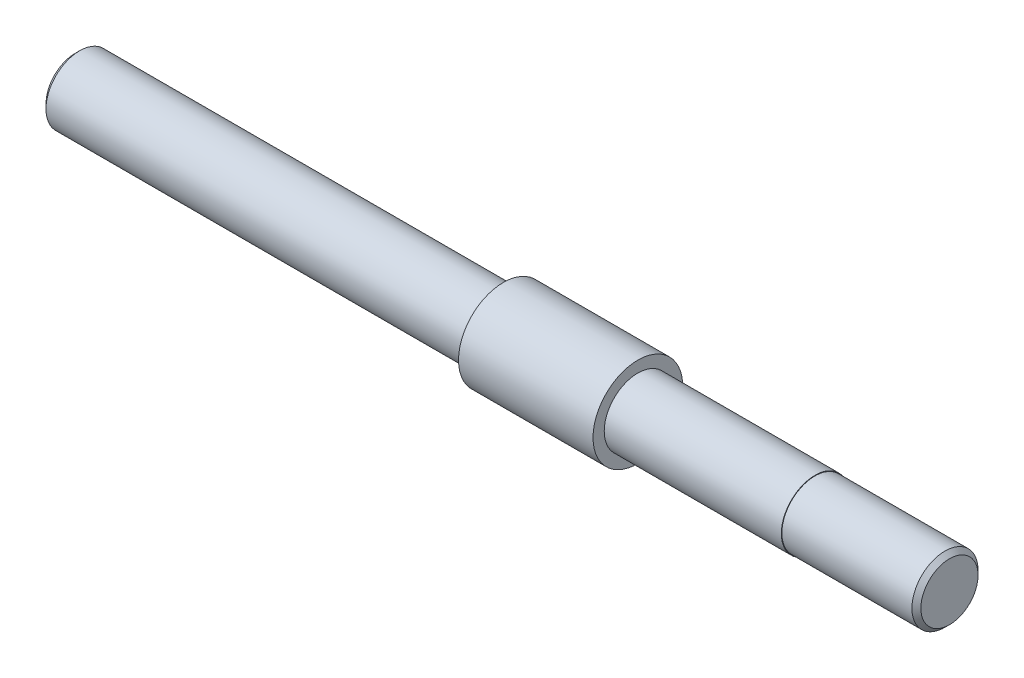
ISO-10303-21;
HEADER;
FILE_DESCRIPTION(('STEP AP214'),'2;1');
FILE_NAME('part.step','',(''),(''),'','','');
FILE_SCHEMA(('AUTOMOTIVE_DESIGN { 1 0 10303 214 1 1 1 1 }'));
ENDSEC;
DATA;
#1=APPLICATION_CONTEXT('core data for automotive mechanical design processes');
#2=APPLICATION_PROTOCOL_DEFINITION('international standard','automotive_design',2000,#1);
#3=PRODUCT_CONTEXT('',#1,'mechanical');
#4=PRODUCT('Part','Part','',(#3));
#5=PRODUCT_RELATED_PRODUCT_CATEGORY('part','',(#4));
#6=PRODUCT_DEFINITION_FORMATION('','',#4);
#7=PRODUCT_DEFINITION_CONTEXT('part definition',#1,'design');
#8=PRODUCT_DEFINITION('design','',#6,#7);
#9=PRODUCT_DEFINITION_SHAPE('','',#8);
#10=(LENGTH_UNIT() NAMED_UNIT(*) SI_UNIT(.MILLI.,.METRE.));
#11=(NAMED_UNIT(*) PLANE_ANGLE_UNIT() SI_UNIT($,.RADIAN.));
#12=(NAMED_UNIT(*) SI_UNIT($,.STERADIAN.) SOLID_ANGLE_UNIT());
#13=UNCERTAINTY_MEASURE_WITH_UNIT(LENGTH_MEASURE(1.E-05),#10,'distance_accuracy_value','');
#14=(GEOMETRIC_REPRESENTATION_CONTEXT(3) GLOBAL_UNCERTAINTY_ASSIGNED_CONTEXT((#13)) GLOBAL_UNIT_ASSIGNED_CONTEXT((#10,
#11,#12)) REPRESENTATION_CONTEXT('',''));
#15=CARTESIAN_POINT('',(0.,0.,0.));
#16=DIRECTION('',(0.,0.,1.));
#17=DIRECTION('',(1.,0.,0.));
#18=AXIS2_PLACEMENT_3D('',#15,#16,#17);
#19=CARTESIAN_POINT('',(0.,0.,0.));
#20=DIRECTION('',(-1.,0.,0.));
#21=DIRECTION('',(0.,0.,1.));
#22=AXIS2_PLACEMENT_3D('',#19,#20,#21);
#23=PLANE('',#22);
#24=CARTESIAN_POINT('',(0.,0.,0.));
#25=DIRECTION('',(-1.,0.,0.));
#26=DIRECTION('',(0.,0.,1.));
#27=AXIS2_PLACEMENT_3D('',#24,#25,#26);
#28=CIRCLE('',#27,1.27499999999999);
#29=CARTESIAN_POINT('',(0.,0.,1.27499999999999));
#30=VERTEX_POINT('',#29);
#31=EDGE_CURVE('E10',#30,#30,#28,.F.);
#32=ORIENTED_EDGE('',*,*,#31,.T.);
#33=EDGE_LOOP('',(#32));
#34=FACE_BOUND('',#33,.T.);
#35=ADVANCED_FACE('F34',(#34),#23,.F.);
#36=CARTESIAN_POINT('',(-12.0887675927148,0.,0.));
#37=DIRECTION('',(-1.,0.,0.));
#38=DIRECTION('',(0.,0.,1.));
#39=AXIS2_PLACEMENT_3D('',#36,#37,#38);
#40=CYLINDRICAL_SURFACE('',#39,1.475);
#41=CARTESIAN_POINT('',(-0.200000000000006,0.,0.));
#42=DIRECTION('',(-1.,0.,0.));
#43=DIRECTION('',(0.,0.,1.));
#44=AXIS2_PLACEMENT_3D('',#41,#42,#43);
#45=CIRCLE('',#44,1.475);
#46=CARTESIAN_POINT('',(-0.200000000000006,0.,1.475));
#47=VERTEX_POINT('',#46);
#48=EDGE_CURVE('E41',#47,#47,#45,.T.);
#49=ORIENTED_EDGE('',*,*,#48,.T.);
#50=EDGE_LOOP('',(#49));
#51=FACE_BOUND('',#50,.T.);
#52=CARTESIAN_POINT('',(-6.,0.,0.));
#53=DIRECTION('',(-1.,0.,0.));
#54=DIRECTION('',(0.,0.,1.));
#55=AXIS2_PLACEMENT_3D('',#52,#53,#54);
#56=CIRCLE('',#55,1.475);
#57=CARTESIAN_POINT('',(-6.,0.,1.475));
#58=VERTEX_POINT('',#57);
#59=EDGE_CURVE('E54',#58,#58,#56,.T.);
#60=ORIENTED_EDGE('',*,*,#59,.F.);
#61=EDGE_LOOP('',(#60));
#62=FACE_BOUND('',#61,.T.);
#63=ADVANCED_FACE('F102',(#51,#62),#40,.T.);
#64=CARTESIAN_POINT('',(-6.,1.475,0.));
#65=DIRECTION('',(-1.,0.,0.));
#66=DIRECTION('',(0.,0.,1.));
#67=AXIS2_PLACEMENT_3D('',#64,#65,#66);
#68=PLANE('',#67);
#69=CARTESIAN_POINT('',(-6.,0.,0.));
#70=DIRECTION('',(-1.,0.,0.));
#71=DIRECTION('',(0.,0.,1.));
#72=AXIS2_PLACEMENT_3D('',#69,#70,#71);
#73=CIRCLE('',#72,1.5);
#74=CARTESIAN_POINT('',(-6.,0.,1.5));
#75=VERTEX_POINT('',#74);
#76=EDGE_CURVE('E57',#75,#75,#73,.T.);
#77=ORIENTED_EDGE('',*,*,#76,.F.);
#78=EDGE_LOOP('',(#77));
#79=FACE_BOUND('',#78,.T.);
#80=ORIENTED_EDGE('',*,*,#59,.T.);
#81=EDGE_LOOP('',(#80));
#82=FACE_BOUND('',#81,.T.);
#83=ADVANCED_FACE('F96',(#79,#82),#68,.F.);
#84=CARTESIAN_POINT('',(-12.0887675927148,0.,0.));
#85=DIRECTION('',(-1.,0.,0.));
#86=DIRECTION('',(0.,0.,1.));
#87=AXIS2_PLACEMENT_3D('',#84,#85,#86);
#88=CYLINDRICAL_SURFACE('',#87,1.5);
#89=CARTESIAN_POINT('',(-13.9,0.,0.));
#90=DIRECTION('',(-1.,0.,0.));
#91=DIRECTION('',(0.,0.,1.));
#92=AXIS2_PLACEMENT_3D('',#89,#90,#91);
#93=CIRCLE('',#92,1.5);
#94=CARTESIAN_POINT('',(-13.9,0.,1.5));
#95=VERTEX_POINT('',#94);
#96=EDGE_CURVE('E60',#95,#95,#93,.T.);
#97=ORIENTED_EDGE('',*,*,#96,.F.);
#98=EDGE_LOOP('',(#97));
#99=FACE_BOUND('',#98,.T.);
#100=ORIENTED_EDGE('',*,*,#76,.T.);
#101=EDGE_LOOP('',(#100));
#102=FACE_BOUND('',#101,.T.);
#103=ADVANCED_FACE('F90',(#99,#102),#88,.T.);
#104=CARTESIAN_POINT('',(-13.9,1.5,0.));
#105=DIRECTION('',(-1.,0.,0.));
#106=DIRECTION('',(0.,0.,1.));
#107=AXIS2_PLACEMENT_3D('',#104,#105,#106);
#108=PLANE('',#107);
#109=CARTESIAN_POINT('',(-13.9,0.,0.));
#110=DIRECTION('',(-1.,0.,0.));
#111=DIRECTION('',(0.,0.,1.));
#112=AXIS2_PLACEMENT_3D('',#109,#110,#111);
#113=CIRCLE('',#112,2.);
#114=CARTESIAN_POINT('',(-13.9,0.,2.));
#115=VERTEX_POINT('',#114);
#116=EDGE_CURVE('E63',#115,#115,#113,.T.);
#117=ORIENTED_EDGE('',*,*,#116,.F.);
#118=EDGE_LOOP('',(#117));
#119=FACE_BOUND('',#118,.T.);
#120=ORIENTED_EDGE('',*,*,#96,.T.);
#121=EDGE_LOOP('',(#120));
#122=FACE_BOUND('',#121,.T.);
#123=ADVANCED_FACE('F84',(#119,#122),#108,.F.);
#124=CARTESIAN_POINT('',(-12.0887675927148,0.,0.));
#125=DIRECTION('',(-1.,0.,0.));
#126=DIRECTION('',(0.,0.,1.));
#127=AXIS2_PLACEMENT_3D('',#124,#125,#126);
#128=CYLINDRICAL_SURFACE('',#127,2.);
#129=CARTESIAN_POINT('',(-19.9,0.,0.));
#130=DIRECTION('',(-1.,0.,0.));
#131=DIRECTION('',(0.,0.,1.));
#132=AXIS2_PLACEMENT_3D('',#129,#130,#131);
#133=CIRCLE('',#132,2.);
#134=CARTESIAN_POINT('',(-19.9,0.,2.));
#135=VERTEX_POINT('',#134);
#136=EDGE_CURVE('E66',#135,#135,#133,.T.);
#137=ORIENTED_EDGE('',*,*,#136,.F.);
#138=EDGE_LOOP('',(#137));
#139=FACE_BOUND('',#138,.T.);
#140=ORIENTED_EDGE('',*,*,#116,.T.);
#141=EDGE_LOOP('',(#140));
#142=FACE_BOUND('',#141,.T.);
#143=ADVANCED_FACE('F78',(#139,#142),#128,.T.);
#144=CARTESIAN_POINT('',(-19.9,2.,0.));
#145=DIRECTION('',(1.,0.,0.));
#146=DIRECTION('',(0.,0.,-1.));
#147=AXIS2_PLACEMENT_3D('',#144,#145,#146);
#148=PLANE('',#147);
#149=CARTESIAN_POINT('',(-19.9,0.,0.));
#150=DIRECTION('',(-1.,0.,0.));
#151=DIRECTION('',(0.,0.,1.));
#152=AXIS2_PLACEMENT_3D('',#149,#150,#151);
#153=CIRCLE('',#152,1.5);
#154=CARTESIAN_POINT('',(-19.9,0.,1.5));
#155=VERTEX_POINT('',#154);
#156=EDGE_CURVE('E69',#155,#155,#153,.T.);
#157=ORIENTED_EDGE('',*,*,#156,.F.);
#158=EDGE_LOOP('',(#157));
#159=FACE_BOUND('',#158,.T.);
#160=ORIENTED_EDGE('',*,*,#136,.T.);
#161=EDGE_LOOP('',(#160));
#162=FACE_BOUND('',#161,.T.);
#163=ADVANCED_FACE('F75',(#159,#162),#148,.F.);
#164=CARTESIAN_POINT('',(-12.0887675927148,0.,0.));
#165=DIRECTION('',(-1.,0.,0.));
#166=DIRECTION('',(0.,0.,1.));
#167=AXIS2_PLACEMENT_3D('',#164,#165,#166);
#168=CYLINDRICAL_SURFACE('',#167,1.5);
#169=CARTESIAN_POINT('',(-38.8,0.,0.));
#170=DIRECTION('',(1.,0.,0.));
#171=DIRECTION('',(0.,0.,-1.));
#172=AXIS2_PLACEMENT_3D('',#169,#170,#171);
#173=CIRCLE('',#172,1.5);
#174=CARTESIAN_POINT('',(-38.8,0.,-1.5));
#175=VERTEX_POINT('',#174);
#176=EDGE_CURVE('E45',#175,#175,#173,.T.);
#177=ORIENTED_EDGE('',*,*,#176,.T.);
#178=EDGE_LOOP('',(#177));
#179=FACE_BOUND('',#178,.T.);
#180=ORIENTED_EDGE('',*,*,#156,.T.);
#181=EDGE_LOOP('',(#180));
#182=FACE_BOUND('',#181,.T.);
#183=ADVANCED_FACE('F73',(#179,#182),#168,.T.);
#184=CARTESIAN_POINT('',(-39.,1.5,0.));
#185=DIRECTION('',(1.,0.,0.));
#186=DIRECTION('',(0.,0.,-1.));
#187=AXIS2_PLACEMENT_3D('',#184,#185,#186);
#188=PLANE('',#187);
#189=CARTESIAN_POINT('',(-39.,0.,0.));
#190=DIRECTION('',(1.,0.,0.));
#191=DIRECTION('',(0.,0.,-1.));
#192=AXIS2_PLACEMENT_3D('',#189,#190,#191);
#193=CIRCLE('',#192,1.3);
#194=CARTESIAN_POINT('',(-39.,0.,-1.3));
#195=VERTEX_POINT('',#194);
#196=EDGE_CURVE('E49',#195,#195,#193,.F.);
#197=ORIENTED_EDGE('',*,*,#196,.T.);
#198=EDGE_LOOP('',(#197));
#199=FACE_BOUND('',#198,.T.);
#200=ADVANCED_FACE('F114',(#199),#188,.F.);
#201=CARTESIAN_POINT('',(-39.,0.,0.));
#202=DIRECTION('',(1.,0.,0.));
#203=DIRECTION('',(0.,0.,-1.));
#204=AXIS2_PLACEMENT_3D('',#201,#202,#203);
#205=CONICAL_SURFACE('',#204,1.3,0.785398163397451);
#206=ORIENTED_EDGE('',*,*,#176,.F.);
#207=EDGE_LOOP('',(#206));
#208=FACE_BOUND('',#207,.T.);
#209=ORIENTED_EDGE('',*,*,#196,.F.);
#210=EDGE_LOOP('',(#209));
#211=FACE_BOUND('',#210,.T.);
#212=ADVANCED_FACE('F112',(#208,#211),#205,.T.);
#213=CARTESIAN_POINT('',(-0.200000000000006,0.,0.));
#214=DIRECTION('',(-1.,0.,0.));
#215=DIRECTION('',(0.,0.,1.));
#216=AXIS2_PLACEMENT_3D('',#213,#214,#215);
#217=CONICAL_SURFACE('',#216,1.475,0.785398163397446);
#218=ORIENTED_EDGE('',*,*,#31,.F.);
#219=EDGE_LOOP('',(#218));
#220=FACE_BOUND('',#219,.T.);
#221=ORIENTED_EDGE('',*,*,#48,.F.);
#222=EDGE_LOOP('',(#221));
#223=FACE_BOUND('',#222,.T.);
#224=ADVANCED_FACE('F36',(#220,#223),#217,.T.);
#225=CLOSED_SHELL('',(#35,#63,#83,#103,#123,#143,#163,#183,#200,#212,#224));
#226=MANIFOLD_SOLID_BREP('B2',#225);
#227=ADVANCED_BREP_SHAPE_REPRESENTATION('',(#18,#226),#14);
#228=SHAPE_DEFINITION_REPRESENTATION(#9,#227);
ENDSEC;
END-ISO-10303-21;
